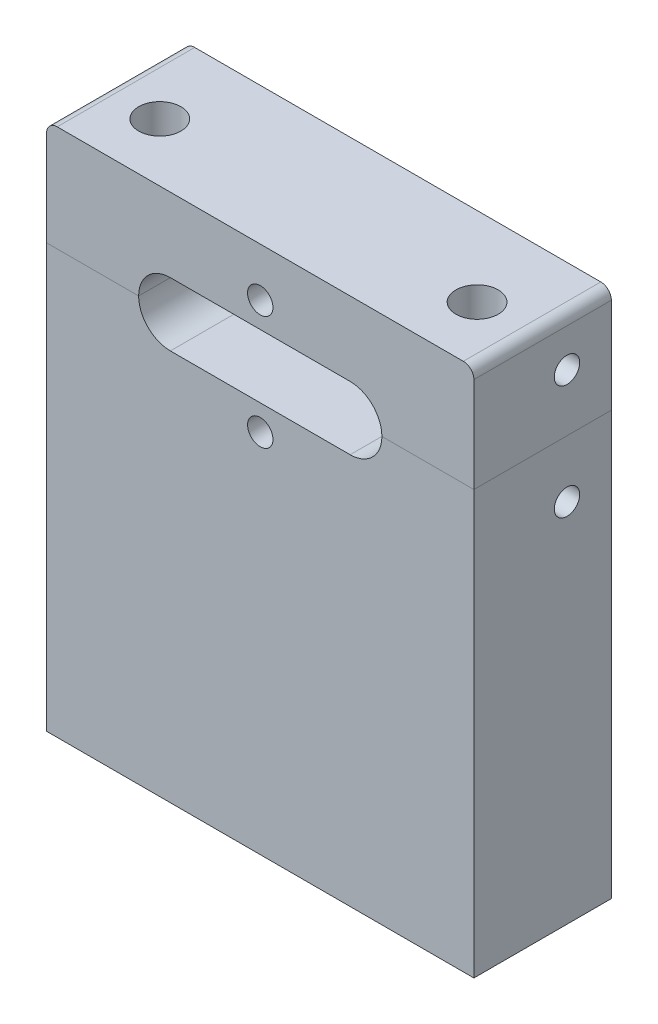
ISO-10303-21;
HEADER;
FILE_DESCRIPTION(('STEP AP214'),'2;1');
FILE_NAME('part.step','',(''),(''),'','','');
FILE_SCHEMA(('AUTOMOTIVE_DESIGN { 1 0 10303 214 1 1 1 1 }'));
ENDSEC;
DATA;
#1=APPLICATION_CONTEXT('core data for automotive mechanical design processes');
#2=APPLICATION_PROTOCOL_DEFINITION('international standard','automotive_design',2000,#1);
#3=PRODUCT_CONTEXT('',#1,'mechanical');
#4=PRODUCT('Part','Part','',(#3));
#5=PRODUCT_RELATED_PRODUCT_CATEGORY('part','',(#4));
#6=PRODUCT_DEFINITION_FORMATION('','',#4);
#7=PRODUCT_DEFINITION_CONTEXT('part definition',#1,'design');
#8=PRODUCT_DEFINITION('design','',#6,#7);
#9=PRODUCT_DEFINITION_SHAPE('','',#8);
#10=(LENGTH_UNIT() NAMED_UNIT(*) SI_UNIT(.MILLI.,.METRE.));
#11=(NAMED_UNIT(*) PLANE_ANGLE_UNIT() SI_UNIT($,.RADIAN.));
#12=(NAMED_UNIT(*) SI_UNIT($,.STERADIAN.) SOLID_ANGLE_UNIT());
#13=UNCERTAINTY_MEASURE_WITH_UNIT(LENGTH_MEASURE(1.E-05),#10,'distance_accuracy_value','');
#14=(GEOMETRIC_REPRESENTATION_CONTEXT(3) GLOBAL_UNCERTAINTY_ASSIGNED_CONTEXT((#13)) GLOBAL_UNIT_ASSIGNED_CONTEXT((#10,
#11,#12)) REPRESENTATION_CONTEXT('',''));
#15=CARTESIAN_POINT('',(0.,0.,0.));
#16=DIRECTION('',(0.,0.,1.));
#17=DIRECTION('',(1.,0.,0.));
#18=AXIS2_PLACEMENT_3D('',#15,#16,#17);
#19=CARTESIAN_POINT('',(0.,25.4,0.));
#20=DIRECTION('',(0.,1.,0.));
#21=DIRECTION('',(0.,0.,1.));
#22=AXIS2_PLACEMENT_3D('',#19,#20,#21);
#23=PLANE('',#22);
#24=DIRECTION('',(0.,0.,-1.));
#25=VECTOR('',#24,1.);
#26=CARTESIAN_POINT('',(-7.3025,25.4,21.2725));
#27=LINE('',#26,#25);
#28=CARTESIAN_POINT('',(-7.3025,25.4,4.1275));
#29=VERTEX_POINT('',#28);
#30=CARTESIAN_POINT('',(-7.3025,25.4,-4.1275));
#31=VERTEX_POINT('',#30);
#32=EDGE_CURVE('E129',#29,#31,#27,.T.);
#33=ORIENTED_EDGE('',*,*,#32,.T.);
#34=DIRECTION('',(-1.,0.,0.));
#35=VECTOR('',#34,1.);
#36=CARTESIAN_POINT('',(-12.827,25.4,-4.1275));
#37=LINE('',#36,#35);
#38=CARTESIAN_POINT('',(-12.827,25.4,-4.1275));
#39=VERTEX_POINT('',#38);
#40=EDGE_CURVE('E124',#31,#39,#37,.T.);
#41=ORIENTED_EDGE('',*,*,#40,.T.);
#42=DIRECTION('',(0.,0.,1.));
#43=VECTOR('',#42,1.);
#44=CARTESIAN_POINT('',(-12.827,25.4,4.1275));
#45=LINE('',#44,#43);
#46=CARTESIAN_POINT('',(-12.827,25.4,4.1275));
#47=VERTEX_POINT('',#46);
#48=EDGE_CURVE('E188',#39,#47,#45,.T.);
#49=ORIENTED_EDGE('',*,*,#48,.T.);
#50=DIRECTION('',(1.,0.,0.));
#51=VECTOR('',#50,1.);
#52=CARTESIAN_POINT('',(-12.827,25.4,4.1275));
#53=LINE('',#52,#51);
#54=EDGE_CURVE('E190',#47,#29,#53,.T.);
#55=ORIENTED_EDGE('',*,*,#54,.T.);
#56=EDGE_LOOP('',(#33,#41,#49,#55));
#57=FACE_BOUND('',#56,.T.);
#58=CARTESIAN_POINT('',(-9.525,25.4,0.635));
#59=DIRECTION('',(0.,1.,0.));
#60=DIRECTION('',(0.,0.,1.));
#61=AXIS2_PLACEMENT_3D('',#58,#59,#60);
#62=CIRCLE('',#61,1.27);
#63=CARTESIAN_POINT('',(-9.525,25.4,1.905));
#64=VERTEX_POINT('',#63);
#65=EDGE_CURVE('E136',#64,#64,#62,.F.);
#66=ORIENTED_EDGE('',*,*,#65,.T.);
#67=EDGE_LOOP('',(#66));
#68=FACE_BOUND('',#67,.T.);
#69=ADVANCED_FACE('F42',(#57,#68),#23,.T.);
#70=CARTESIAN_POINT('',(7.3025,25.4,4.1275));
#71=VERTEX_POINT('',#70);
#72=CARTESIAN_POINT('',(12.827,25.4,4.1275));
#73=VERTEX_POINT('',#72);
#74=EDGE_CURVE('E133',#71,#73,#53,.T.);
#75=ORIENTED_EDGE('',*,*,#74,.T.);
#76=DIRECTION('',(0.,0.,-1.));
#77=VECTOR('',#76,1.);
#78=CARTESIAN_POINT('',(12.827,25.4,4.1275));
#79=LINE('',#78,#77);
#80=CARTESIAN_POINT('',(12.827,25.4,-4.1275));
#81=VERTEX_POINT('',#80);
#82=EDGE_CURVE('E123',#73,#81,#79,.T.);
#83=ORIENTED_EDGE('',*,*,#82,.T.);
#84=CARTESIAN_POINT('',(7.3025,25.4,-4.1275));
#85=VERTEX_POINT('',#84);
#86=EDGE_CURVE('E112',#81,#85,#37,.T.);
#87=ORIENTED_EDGE('',*,*,#86,.T.);
#88=DIRECTION('',(0.,0.,-1.));
#89=VECTOR('',#88,1.);
#90=CARTESIAN_POINT('',(7.3025,25.4,21.2725));
#91=LINE('',#90,#89);
#92=EDGE_CURVE('E121',#85,#71,#91,.F.);
#93=ORIENTED_EDGE('',*,*,#92,.T.);
#94=EDGE_LOOP('',(#75,#83,#87,#93));
#95=FACE_BOUND('',#94,.T.);
#96=CARTESIAN_POINT('',(9.525,25.4,0.635));
#97=DIRECTION('',(0.,1.,0.));
#98=DIRECTION('',(0.,0.,1.));
#99=AXIS2_PLACEMENT_3D('',#96,#97,#98);
#100=CIRCLE('',#99,1.27);
#101=CARTESIAN_POINT('',(9.525,25.4,1.905));
#102=VERTEX_POINT('',#101);
#103=EDGE_CURVE('E130',#102,#102,#100,.F.);
#104=ORIENTED_EDGE('',*,*,#103,.T.);
#105=EDGE_LOOP('',(#104));
#106=FACE_BOUND('',#105,.T.);
#107=ADVANCED_FACE('F119',(#95,#106),#23,.T.);
#108=CARTESIAN_POINT('',(9.525,19.05,0.635));
#109=DIRECTION('',(0.,1.,0.));
#110=DIRECTION('',(0.,0.,1.));
#111=AXIS2_PLACEMENT_3D('',#108,#109,#110);
#112=PLANE('',#111);
#113=CARTESIAN_POINT('',(9.525,19.05,0.635));
#114=DIRECTION('',(0.,1.,0.));
#115=DIRECTION('',(0.,0.,1.));
#116=AXIS2_PLACEMENT_3D('',#113,#114,#115);
#117=CIRCLE('',#116,1.27);
#118=CARTESIAN_POINT('',(9.525,19.05,1.905));
#119=VERTEX_POINT('',#118);
#120=EDGE_CURVE('E51',#119,#119,#117,.T.);
#121=ORIENTED_EDGE('',*,*,#120,.T.);
#122=EDGE_LOOP('',(#121));
#123=FACE_BOUND('',#122,.T.);
#124=ADVANCED_FACE('F224',(#123),#112,.T.);
#125=CARTESIAN_POINT('',(9.525,19.05,0.635));
#126=DIRECTION('',(0.,1.,0.));
#127=DIRECTION('',(0.,0.,1.));
#128=AXIS2_PLACEMENT_3D('',#125,#126,#127);
#129=CYLINDRICAL_SURFACE('',#128,1.27);
#130=ORIENTED_EDGE('',*,*,#120,.F.);
#131=EDGE_LOOP('',(#130));
#132=FACE_BOUND('',#131,.T.);
#133=ORIENTED_EDGE('',*,*,#103,.F.);
#134=EDGE_LOOP('',(#133));
#135=FACE_BOUND('',#134,.T.);
#136=ADVANCED_FACE('F232',(#132,#135),#129,.F.);
#137=CARTESIAN_POINT('',(12.827,31.75,4.1275));
#138=DIRECTION('',(-1.,0.,0.));
#139=DIRECTION('',(0.,0.,1.));
#140=AXIS2_PLACEMENT_3D('',#137,#138,#139);
#141=PLANE('',#140);
#142=CARTESIAN_POINT('',(12.827,21.971,-1.4605));
#143=DIRECTION('',(1.,0.,0.));
#144=DIRECTION('',(0.,0.,-1.));
#145=AXIS2_PLACEMENT_3D('',#142,#143,#144);
#146=CIRCLE('',#145,0.762);
#147=CARTESIAN_POINT('',(12.827,21.971,-2.2225));
#148=VERTEX_POINT('',#147);
#149=EDGE_CURVE('E179',#148,#148,#146,.T.);
#150=ORIENTED_EDGE('',*,*,#149,.F.);
#151=EDGE_LOOP('',(#150));
#152=FACE_BOUND('',#151,.T.);
#153=ORIENTED_EDGE('',*,*,#82,.F.);
#154=DIRECTION('',(0.,-1.,0.));
#155=VECTOR('',#154,1.);
#156=CARTESIAN_POINT('',(12.827,31.75,4.1275));
#157=LINE('',#156,#155);
#158=CARTESIAN_POINT('',(12.827,0.,4.1275));
#159=VERTEX_POINT('',#158);
#160=EDGE_CURVE('E152',#73,#159,#157,.T.);
#161=ORIENTED_EDGE('',*,*,#160,.T.);
#162=DIRECTION('',(0.,0.,-1.));
#163=VECTOR('',#162,1.);
#164=CARTESIAN_POINT('',(12.827,0.,4.1275));
#165=LINE('',#164,#163);
#166=CARTESIAN_POINT('',(12.827,0.,-4.1275));
#167=VERTEX_POINT('',#166);
#168=EDGE_CURVE('E169',#159,#167,#165,.T.);
#169=ORIENTED_EDGE('',*,*,#168,.T.);
#170=DIRECTION('',(0.,-1.,0.));
#171=VECTOR('',#170,1.);
#172=CARTESIAN_POINT('',(12.827,31.75,-4.1275));
#173=LINE('',#172,#171);
#174=EDGE_CURVE('E146',#81,#167,#173,.T.);
#175=ORIENTED_EDGE('',*,*,#174,.F.);
#176=EDGE_LOOP('',(#153,#161,#169,#175));
#177=FACE_BOUND('',#176,.T.);
#178=ADVANCED_FACE('F235',(#152,#177),#141,.F.);
#179=CARTESIAN_POINT('',(-12.827,31.75,-4.1275));
#180=DIRECTION('',(0.,0.,1.));
#181=DIRECTION('',(1.,0.,0.));
#182=AXIS2_PLACEMENT_3D('',#179,#180,#181);
#183=PLANE('',#182);
#184=ORIENTED_EDGE('',*,*,#86,.F.);
#185=ORIENTED_EDGE('',*,*,#174,.T.);
#186=DIRECTION('',(-1.,0.,0.));
#187=VECTOR('',#186,1.);
#188=CARTESIAN_POINT('',(-12.827,0.,-4.1275));
#189=LINE('',#188,#187);
#190=CARTESIAN_POINT('',(-12.827,0.,-4.1275));
#191=VERTEX_POINT('',#190);
#192=EDGE_CURVE('E163',#167,#191,#189,.T.);
#193=ORIENTED_EDGE('',*,*,#192,.T.);
#194=DIRECTION('',(0.,-1.,0.));
#195=VECTOR('',#194,1.);
#196=CARTESIAN_POINT('',(-12.827,31.75,-4.1275));
#197=LINE('',#196,#195);
#198=EDGE_CURVE('E148',#39,#191,#197,.T.);
#199=ORIENTED_EDGE('',*,*,#198,.F.);
#200=ORIENTED_EDGE('',*,*,#40,.F.);
#201=CARTESIAN_POINT('',(-5.3975,25.4,-4.1275));
#202=DIRECTION('',(0.,0.,-1.));
#203=DIRECTION('',(-1.,0.,0.));
#204=AXIS2_PLACEMENT_3D('',#201,#202,#203);
#205=CIRCLE('',#204,1.905);
#206=CARTESIAN_POINT('',(-5.3975,23.495,-4.1275));
#207=VERTEX_POINT('',#206);
#208=EDGE_CURVE('E46',#207,#31,#205,.T.);
#209=ORIENTED_EDGE('',*,*,#208,.F.);
#210=DIRECTION('',(-1.,0.,0.));
#211=VECTOR('',#210,1.);
#212=CARTESIAN_POINT('',(-5.3975,23.495,-4.1275));
#213=LINE('',#212,#211);
#214=CARTESIAN_POINT('',(5.3975,23.495,-4.1275));
#215=VERTEX_POINT('',#214);
#216=EDGE_CURVE('E114',#215,#207,#213,.T.);
#217=ORIENTED_EDGE('',*,*,#216,.F.);
#218=CARTESIAN_POINT('',(5.3975,25.4,-4.1275));
#219=DIRECTION('',(0.,0.,-1.));
#220=DIRECTION('',(-1.,0.,0.));
#221=AXIS2_PLACEMENT_3D('',#218,#219,#220);
#222=CIRCLE('',#221,1.905);
#223=EDGE_CURVE('E59',#85,#215,#222,.T.);
#224=ORIENTED_EDGE('',*,*,#223,.F.);
#225=EDGE_LOOP('',(#184,#185,#193,#199,#200,#209,#217,#224));
#226=FACE_BOUND('',#225,.T.);
#227=ADVANCED_FACE('F111',(#226),#183,.F.);
#228=CARTESIAN_POINT('',(-12.827,31.75,4.1275));
#229=DIRECTION('',(1.,0.,0.));
#230=DIRECTION('',(0.,0.,-1.));
#231=AXIS2_PLACEMENT_3D('',#228,#229,#230);
#232=PLANE('',#231);
#233=ORIENTED_EDGE('',*,*,#48,.F.);
#234=ORIENTED_EDGE('',*,*,#198,.T.);
#235=DIRECTION('',(0.,0.,1.));
#236=VECTOR('',#235,1.);
#237=CARTESIAN_POINT('',(-12.827,0.,4.1275));
#238=LINE('',#237,#236);
#239=CARTESIAN_POINT('',(-12.827,0.,4.1275));
#240=VERTEX_POINT('',#239);
#241=EDGE_CURVE('E157',#191,#240,#238,.T.);
#242=ORIENTED_EDGE('',*,*,#241,.T.);
#243=DIRECTION('',(0.,-1.,0.));
#244=VECTOR('',#243,1.);
#245=CARTESIAN_POINT('',(-12.827,31.75,4.1275));
#246=LINE('',#245,#244);
#247=EDGE_CURVE('E150',#47,#240,#246,.T.);
#248=ORIENTED_EDGE('',*,*,#247,.F.);
#249=EDGE_LOOP('',(#233,#234,#242,#248));
#250=FACE_BOUND('',#249,.T.);
#251=ADVANCED_FACE('F199',(#250),#232,.F.);
#252=CARTESIAN_POINT('',(-12.827,31.75,4.1275));
#253=DIRECTION('',(0.,0.,-1.));
#254=DIRECTION('',(-1.,0.,0.));
#255=AXIS2_PLACEMENT_3D('',#252,#253,#254);
#256=PLANE('',#255);
#257=CARTESIAN_POINT('',(0.,21.971,4.1275));
#258=DIRECTION('',(0.,0.,1.));
#259=DIRECTION('',(1.,0.,0.));
#260=AXIS2_PLACEMENT_3D('',#257,#258,#259);
#261=CIRCLE('',#260,0.762);
#262=CARTESIAN_POINT('',(-0.761999999999999,21.971,4.1275));
#263=VERTEX_POINT('',#262);
#264=EDGE_CURVE('E175',#263,#263,#261,.T.);
#265=ORIENTED_EDGE('',*,*,#264,.F.);
#266=EDGE_LOOP('',(#265));
#267=FACE_BOUND('',#266,.T.);
#268=ORIENTED_EDGE('',*,*,#54,.F.);
#269=ORIENTED_EDGE('',*,*,#247,.T.);
#270=DIRECTION('',(1.,0.,0.));
#271=VECTOR('',#270,1.);
#272=CARTESIAN_POINT('',(-12.827,0.,4.1275));
#273=LINE('',#272,#271);
#274=EDGE_CURVE('E153',#240,#159,#273,.T.);
#275=ORIENTED_EDGE('',*,*,#274,.T.);
#276=ORIENTED_EDGE('',*,*,#160,.F.);
#277=ORIENTED_EDGE('',*,*,#74,.F.);
#278=CARTESIAN_POINT('',(5.3975,25.4,4.1275));
#279=DIRECTION('',(0.,0.,-1.));
#280=DIRECTION('',(-1.,0.,0.));
#281=AXIS2_PLACEMENT_3D('',#278,#279,#280);
#282=CIRCLE('',#281,1.905);
#283=CARTESIAN_POINT('',(5.3975,23.495,4.1275));
#284=VERTEX_POINT('',#283);
#285=EDGE_CURVE('E127',#71,#284,#282,.T.);
#286=ORIENTED_EDGE('',*,*,#285,.T.);
#287=DIRECTION('',(-1.,0.,0.));
#288=VECTOR('',#287,1.);
#289=CARTESIAN_POINT('',(-12.827,23.495,4.1275));
#290=LINE('',#289,#288);
#291=CARTESIAN_POINT('',(-5.3975,23.495,4.1275));
#292=VERTEX_POINT('',#291);
#293=EDGE_CURVE('E144',#284,#292,#290,.T.);
#294=ORIENTED_EDGE('',*,*,#293,.T.);
#295=CARTESIAN_POINT('',(-5.3975,25.4,4.1275));
#296=DIRECTION('',(0.,0.,-1.));
#297=DIRECTION('',(-1.,0.,0.));
#298=AXIS2_PLACEMENT_3D('',#295,#296,#297);
#299=CIRCLE('',#298,1.905);
#300=EDGE_CURVE('E142',#292,#29,#299,.T.);
#301=ORIENTED_EDGE('',*,*,#300,.T.);
#302=EDGE_LOOP('',(#268,#269,#275,#276,#277,#286,#294,#301));
#303=FACE_BOUND('',#302,.T.);
#304=ADVANCED_FACE('F201',(#267,#303),#256,.F.);
#305=CARTESIAN_POINT('',(-5.3975,25.4,21.2725));
#306=DIRECTION('',(0.,0.,-1.));
#307=DIRECTION('',(-1.,0.,0.));
#308=AXIS2_PLACEMENT_3D('',#305,#306,#307);
#309=CYLINDRICAL_SURFACE('',#308,1.905);
#310=ORIENTED_EDGE('',*,*,#32,.F.);
#311=ORIENTED_EDGE('',*,*,#300,.F.);
#312=DIRECTION('',(0.,0.,-1.));
#313=VECTOR('',#312,1.);
#314=CARTESIAN_POINT('',(-5.3975,23.495,21.2725));
#315=LINE('',#314,#313);
#316=EDGE_CURVE('E67',#292,#207,#315,.T.);
#317=ORIENTED_EDGE('',*,*,#316,.T.);
#318=ORIENTED_EDGE('',*,*,#208,.T.);
#319=EDGE_LOOP('',(#310,#311,#317,#318));
#320=FACE_BOUND('',#319,.T.);
#321=ADVANCED_FACE('F44',(#320),#309,.F.);
#322=CARTESIAN_POINT('',(5.3975,25.4,21.2725));
#323=DIRECTION('',(0.,0.,-1.));
#324=DIRECTION('',(-1.,0.,0.));
#325=AXIS2_PLACEMENT_3D('',#322,#323,#324);
#326=CYLINDRICAL_SURFACE('',#325,1.905);
#327=ORIENTED_EDGE('',*,*,#92,.F.);
#328=ORIENTED_EDGE('',*,*,#223,.T.);
#329=DIRECTION('',(0.,0.,-1.));
#330=VECTOR('',#329,1.);
#331=CARTESIAN_POINT('',(5.3975,23.495,21.2725));
#332=LINE('',#331,#330);
#333=EDGE_CURVE('E171',#284,#215,#332,.T.);
#334=ORIENTED_EDGE('',*,*,#333,.F.);
#335=ORIENTED_EDGE('',*,*,#285,.F.);
#336=EDGE_LOOP('',(#327,#328,#334,#335));
#337=FACE_BOUND('',#336,.T.);
#338=ADVANCED_FACE('F126',(#337),#326,.F.);
#339=CARTESIAN_POINT('',(0.,0.,0.));
#340=DIRECTION('',(0.,-1.,0.));
#341=DIRECTION('',(0.,0.,-1.));
#342=AXIS2_PLACEMENT_3D('',#339,#340,#341);
#343=PLANE('',#342);
#344=ORIENTED_EDGE('',*,*,#168,.F.);
#345=ORIENTED_EDGE('',*,*,#274,.F.);
#346=ORIENTED_EDGE('',*,*,#241,.F.);
#347=ORIENTED_EDGE('',*,*,#192,.F.);
#348=EDGE_LOOP('',(#344,#345,#346,#347));
#349=FACE_BOUND('',#348,.T.);
#350=ADVANCED_FACE('F245',(#349),#343,.T.);
#351=CARTESIAN_POINT('',(-5.3975,23.495,21.2725));
#352=DIRECTION('',(0.,-1.,0.));
#353=DIRECTION('',(1.,0.,0.));
#354=AXIS2_PLACEMENT_3D('',#351,#352,#353);
#355=PLANE('',#354);
#356=ORIENTED_EDGE('',*,*,#333,.T.);
#357=ORIENTED_EDGE('',*,*,#216,.T.);
#358=ORIENTED_EDGE('',*,*,#316,.F.);
#359=ORIENTED_EDGE('',*,*,#293,.F.);
#360=EDGE_LOOP('',(#356,#357,#358,#359));
#361=FACE_BOUND('',#360,.T.);
#362=ADVANCED_FACE('F247',(#361),#355,.F.);
#363=CARTESIAN_POINT('',(5.588,21.971,4.1275));
#364=DIRECTION('',(0.,1.,0.));
#365=DIRECTION('',(0.,0.,1.));
#366=AXIS2_PLACEMENT_3D('',#363,#364,#365);
#367=TOROIDAL_SURFACE('',#366,5.588,0.762);
#368=CARTESIAN_POINT('',(5.58800000000002,21.971,-1.4605));
#369=DIRECTION('',(-1.,0.,0.));
#370=DIRECTION('',(0.,0.,1.));
#371=AXIS2_PLACEMENT_3D('',#368,#369,#370);
#372=CIRCLE('',#371,0.762);
#373=CARTESIAN_POINT('',(5.58800000000002,21.971,-2.2225));
#374=VERTEX_POINT('',#373);
#375=EDGE_CURVE('E178',#374,#374,#372,.F.);
#376=CARTESIAN_POINT('',(5.588,21.971,4.1275));
#377=DIRECTION('',(0.,1.,0.));
#378=DIRECTION('',(0.,0.,1.));
#379=AXIS2_PLACEMENT_3D('',#376,#377,#378);
#380=CIRCLE('',#379,6.35);
#381=EDGE_CURVE('',#374,#263,#380,.T.);
#382=ORIENTED_EDGE('',*,*,#375,.T.);
#383=ORIENTED_EDGE('',*,*,#264,.T.);
#384=ORIENTED_EDGE('',*,*,#381,.T.);
#385=ORIENTED_EDGE('',*,*,#381,.F.);
#386=EDGE_LOOP('',(#382,#384,#383,#385));
#387=FACE_BOUND('',#386,.T.);
#388=ADVANCED_FACE('F225',(#387),#367,.F.);
#389=CARTESIAN_POINT('',(-12.828,21.971,-1.4605));
#390=DIRECTION('',(1.,0.,0.));
#391=DIRECTION('',(0.,0.,-1.));
#392=AXIS2_PLACEMENT_3D('',#389,#390,#391);
#393=CYLINDRICAL_SURFACE('',#392,0.762);
#394=CARTESIAN_POINT('',(5.58800000000002,21.971,-2.2225));
#395=CARTESIAN_POINT('',(5.66340625000003,21.971,-2.2225));
#396=CARTESIAN_POINT('',(5.73881250000002,21.971,-2.2225));
#397=CARTESIAN_POINT('',(5.88962500000003,21.971,-2.2225));
#398=CARTESIAN_POINT('',(5.96503125000002,21.971,-2.2225));
#399=CARTESIAN_POINT('',(6.11584375000002,21.971,-2.2225));
#400=CARTESIAN_POINT('',(6.19125000000002,21.971,-2.2225));
#401=CARTESIAN_POINT('',(6.34206250000002,21.971,-2.2225));
#402=CARTESIAN_POINT('',(6.41746875000002,21.971,-2.2225));
#403=CARTESIAN_POINT('',(6.56828125000002,21.971,-2.2225));
#404=CARTESIAN_POINT('',(6.64368750000002,21.971,-2.2225));
#405=CARTESIAN_POINT('',(6.79450000000002,21.971,-2.2225));
#406=CARTESIAN_POINT('',(6.86990625000002,21.971,-2.2225));
#407=CARTESIAN_POINT('',(7.02071875000002,21.971,-2.2225));
#408=CARTESIAN_POINT('',(7.09612500000002,21.971,-2.2225));
#409=CARTESIAN_POINT('',(7.24693750000002,21.971,-2.2225));
#410=CARTESIAN_POINT('',(7.32234375000002,21.971,-2.2225));
#411=CARTESIAN_POINT('',(7.47315625000002,21.971,-2.2225));
#412=CARTESIAN_POINT('',(7.54856250000002,21.971,-2.2225));
#413=CARTESIAN_POINT('',(7.69937500000002,21.971,-2.2225));
#414=CARTESIAN_POINT('',(7.77478125000002,21.971,-2.2225));
#415=CARTESIAN_POINT('',(7.92559375000002,21.971,-2.2225));
#416=CARTESIAN_POINT('',(8.00100000000002,21.971,-2.2225));
#417=CARTESIAN_POINT('',(8.15181250000001,21.971,-2.2225));
#418=CARTESIAN_POINT('',(8.22721875000001,21.971,-2.2225));
#419=CARTESIAN_POINT('',(8.37803125000001,21.971,-2.2225));
#420=CARTESIAN_POINT('',(8.45343750000001,21.971,-2.2225));
#421=CARTESIAN_POINT('',(8.60425000000001,21.971,-2.2225));
#422=CARTESIAN_POINT('',(8.67965625000001,21.971,-2.2225));
#423=CARTESIAN_POINT('',(8.83046875000001,21.971,-2.2225));
#424=CARTESIAN_POINT('',(8.90587500000001,21.971,-2.2225));
#425=CARTESIAN_POINT('',(9.05668750000001,21.971,-2.2225));
#426=CARTESIAN_POINT('',(9.13209375000001,21.971,-2.2225));
#427=CARTESIAN_POINT('',(9.28290625000001,21.971,-2.2225));
#428=CARTESIAN_POINT('',(9.35831250000001,21.971,-2.2225));
#429=CARTESIAN_POINT('',(9.50912500000001,21.971,-2.2225));
#430=CARTESIAN_POINT('',(9.58453125000001,21.971,-2.2225));
#431=CARTESIAN_POINT('',(9.73534375000001,21.971,-2.2225));
#432=CARTESIAN_POINT('',(9.81075000000001,21.971,-2.2225));
#433=CARTESIAN_POINT('',(9.9615625,21.971,-2.2225));
#434=CARTESIAN_POINT('',(10.03696875,21.971,-2.2225));
#435=CARTESIAN_POINT('',(10.18778125,21.971,-2.2225));
#436=CARTESIAN_POINT('',(10.2631875,21.971,-2.2225));
#437=CARTESIAN_POINT('',(10.414,21.971,-2.2225));
#438=CARTESIAN_POINT('',(10.48940625,21.971,-2.2225));
#439=CARTESIAN_POINT('',(10.64021875,21.971,-2.2225));
#440=CARTESIAN_POINT('',(10.715625,21.971,-2.2225));
#441=CARTESIAN_POINT('',(10.8664375,21.971,-2.2225));
#442=CARTESIAN_POINT('',(10.94184375,21.971,-2.2225));
#443=CARTESIAN_POINT('',(11.09265625,21.971,-2.2225));
#444=CARTESIAN_POINT('',(11.1680625,21.971,-2.2225));
#445=CARTESIAN_POINT('',(11.318875,21.971,-2.2225));
#446=CARTESIAN_POINT('',(11.39428125,21.971,-2.2225));
#447=CARTESIAN_POINT('',(11.54509375,21.971,-2.2225));
#448=CARTESIAN_POINT('',(11.6205,21.971,-2.2225));
#449=CARTESIAN_POINT('',(11.7713125,21.971,-2.2225));
#450=CARTESIAN_POINT('',(11.84671875,21.971,-2.2225));
#451=CARTESIAN_POINT('',(11.99753125,21.971,-2.2225));
#452=CARTESIAN_POINT('',(12.0729375,21.971,-2.2225));
#453=CARTESIAN_POINT('',(12.22375,21.971,-2.2225));
#454=CARTESIAN_POINT('',(12.29915625,21.971,-2.2225));
#455=CARTESIAN_POINT('',(12.44996875,21.971,-2.2225));
#456=CARTESIAN_POINT('',(12.525375,21.971,-2.2225));
#457=CARTESIAN_POINT('',(12.6761875,21.971,-2.2225));
#458=CARTESIAN_POINT('',(12.75159375,21.971,-2.2225));
#459=CARTESIAN_POINT('',(12.827,21.971,-2.2225));
#460=B_SPLINE_CURVE_WITH_KNOTS('',3,(#394,#395,#396,#397,#398,#399,#400,#401,#402,#403,#404,
#405,#406,#407,#408,#409,#410,#411,#412,#413,#414,#415,#416,#417,#418,#419,#420,#421,#422,#423,
#424,#425,#426,#427,#428,#429,#430,#431,#432,#433,#434,#435,#436,#437,#438,#439,#440,#441,#442,
#443,#444,#445,#446,#447,#448,#449,#450,#451,#452,#453,#454,#455,#456,#457,#458,#459),
.UNSPECIFIED.,.F.,.F.,(4,2,2,2,2,2,2,2,2,2,2,2,2,2,2,2,2,2,2,2,2,2,2,2,2,2,2,2,2,2,2,2,4),(0.,
0.22621875,0.4524375,0.678656249999996,0.904874999999996,1.13109375,1.35731249999999,
1.58353124999999,1.80974999999999,2.03596874999999,2.26218749999999,2.48840624999999,
2.71462499999999,2.94084374999999,3.16706249999998,3.39328124999998,3.61949999999998,
3.84571874999998,4.07193749999998,4.29815624999998,4.52437499999998,4.75059374999998,
4.97681249999998,5.20303124999998,5.42924999999998,5.65546874999998,5.88168749999998,
6.10790624999997,6.33412499999997,6.56034374999997,6.78656249999997,7.01278124999997,
7.23899999999997),.UNSPECIFIED.);
#461=EDGE_CURVE('BSEAM215',#374,#148,#460,.T.);
#462=ORIENTED_EDGE('',*,*,#375,.F.);
#463=ORIENTED_EDGE('',*,*,#149,.T.);
#464=ORIENTED_EDGE('',*,*,#461,.T.);
#465=ORIENTED_EDGE('',*,*,#461,.F.);
#466=EDGE_LOOP('',(#462,#464,#463,#465));
#467=FACE_BOUND('',#466,.T.);
#468=ADVANCED_FACE('F215',(#467),#393,.F.);
#469=CARTESIAN_POINT('',(-9.525,19.05,0.635));
#470=DIRECTION('',(0.,1.,0.));
#471=DIRECTION('',(0.,0.,1.));
#472=AXIS2_PLACEMENT_3D('',#469,#470,#471);
#473=PLANE('',#472);
#474=CARTESIAN_POINT('',(-9.525,19.05,0.635));
#475=DIRECTION('',(0.,1.,0.));
#476=DIRECTION('',(0.,0.,1.));
#477=AXIS2_PLACEMENT_3D('',#474,#475,#476);
#478=CIRCLE('',#477,1.27);
#479=CARTESIAN_POINT('',(-9.525,19.05,1.905));
#480=VERTEX_POINT('',#479);
#481=EDGE_CURVE('E12',#480,#480,#478,.T.);
#482=ORIENTED_EDGE('',*,*,#481,.T.);
#483=EDGE_LOOP('',(#482));
#484=FACE_BOUND('',#483,.T.);
#485=ADVANCED_FACE('F212',(#484),#473,.T.);
#486=CARTESIAN_POINT('',(-9.525,19.05,0.635));
#487=DIRECTION('',(0.,1.,0.));
#488=DIRECTION('',(0.,0.,1.));
#489=AXIS2_PLACEMENT_3D('',#486,#487,#488);
#490=CYLINDRICAL_SURFACE('',#489,1.27);
#491=ORIENTED_EDGE('',*,*,#481,.F.);
#492=EDGE_LOOP('',(#491));
#493=FACE_BOUND('',#492,.T.);
#494=ORIENTED_EDGE('',*,*,#65,.F.);
#495=EDGE_LOOP('',(#494));
#496=FACE_BOUND('',#495,.T.);
#497=ADVANCED_FACE('F214',(#493,#496),#490,.F.);
#498=CLOSED_SHELL('',(#69,#107,#124,#136,#178,#227,#251,#304,#321,#338,#350,#362,#388,#468,#485,#497));
#499=MANIFOLD_SOLID_BREP('B2',#498);
#500=CARTESIAN_POINT('',(0.,25.4,0.));
#501=DIRECTION('',(0.,1.,0.));
#502=DIRECTION('',(0.,0.,1.));
#503=AXIS2_PLACEMENT_3D('',#500,#501,#502);
#504=PLANE('',#503);
#505=CARTESIAN_POINT('',(9.525,25.4,0.635));
#506=DIRECTION('',(0.,1.,0.));
#507=DIRECTION('',(0.,0.,1.));
#508=AXIS2_PLACEMENT_3D('',#505,#506,#507);
#509=CIRCLE('',#508,1.27);
#510=CARTESIAN_POINT('',(9.525,25.4,1.905));
#511=VERTEX_POINT('',#510);
#512=EDGE_CURVE('E509',#511,#511,#509,.F.);
#513=ORIENTED_EDGE('',*,*,#512,.F.);
#514=EDGE_LOOP('',(#513));
#515=FACE_BOUND('',#514,.T.);
#516=DIRECTION('',(1.,0.,0.));
#517=VECTOR('',#516,1.);
#518=CARTESIAN_POINT('',(-12.827,25.4,4.1275));
#519=LINE('',#518,#517);
#520=CARTESIAN_POINT('',(7.3025,25.4,4.1275));
#521=VERTEX_POINT('',#520);
#522=CARTESIAN_POINT('',(12.827,25.4,4.1275));
#523=VERTEX_POINT('',#522);
#524=EDGE_CURVE('E517',#521,#523,#519,.T.);
#525=ORIENTED_EDGE('',*,*,#524,.F.);
#526=DIRECTION('',(0.,0.,-1.));
#527=VECTOR('',#526,1.);
#528=CARTESIAN_POINT('',(7.3025,25.4,21.2725));
#529=LINE('',#528,#527);
#530=CARTESIAN_POINT('',(7.3025,25.4,-4.1275));
#531=VERTEX_POINT('',#530);
#532=EDGE_CURVE('E512',#531,#521,#529,.F.);
#533=ORIENTED_EDGE('',*,*,#532,.F.);
#534=DIRECTION('',(-1.,0.,0.));
#535=VECTOR('',#534,1.);
#536=CARTESIAN_POINT('',(-12.827,25.4,-4.1275));
#537=LINE('',#536,#535);
#538=CARTESIAN_POINT('',(12.827,25.4,-4.1275));
#539=VERTEX_POINT('',#538);
#540=EDGE_CURVE('E371',#539,#531,#537,.T.);
#541=ORIENTED_EDGE('',*,*,#540,.F.);
#542=DIRECTION('',(0.,0.,-1.));
#543=VECTOR('',#542,1.);
#544=CARTESIAN_POINT('',(12.827,25.4,4.1275));
#545=LINE('',#544,#543);
#546=EDGE_CURVE('E40',#523,#539,#545,.T.);
#547=ORIENTED_EDGE('',*,*,#546,.F.);
#548=EDGE_LOOP('',(#525,#533,#541,#547));
#549=FACE_BOUND('',#548,.T.);
#550=ADVANCED_FACE('F362',(#515,#549),#504,.F.);
#551=CARTESIAN_POINT('',(-9.525,25.4,0.635));
#552=DIRECTION('',(0.,1.,0.));
#553=DIRECTION('',(0.,0.,1.));
#554=AXIS2_PLACEMENT_3D('',#551,#552,#553);
#555=CIRCLE('',#554,1.27);
#556=CARTESIAN_POINT('',(-9.525,25.4,1.905));
#557=VERTEX_POINT('',#556);
#558=EDGE_CURVE('E506',#557,#557,#555,.F.);
#559=ORIENTED_EDGE('',*,*,#558,.F.);
#560=EDGE_LOOP('',(#559));
#561=FACE_BOUND('',#560,.T.);
#562=DIRECTION('',(0.,0.,-1.));
#563=VECTOR('',#562,1.);
#564=CARTESIAN_POINT('',(-7.3025,25.4,21.2725));
#565=LINE('',#564,#563);
#566=CARTESIAN_POINT('',(-7.3025,25.4,4.1275));
#567=VERTEX_POINT('',#566);
#568=CARTESIAN_POINT('',(-7.3025,25.4,-4.1275));
#569=VERTEX_POINT('',#568);
#570=EDGE_CURVE('E514',#567,#569,#565,.T.);
#571=ORIENTED_EDGE('',*,*,#570,.F.);
#572=CARTESIAN_POINT('',(-12.827,25.4,4.1275));
#573=VERTEX_POINT('',#572);
#574=EDGE_CURVE('E515',#573,#567,#519,.T.);
#575=ORIENTED_EDGE('',*,*,#574,.F.);
#576=DIRECTION('',(0.,0.,1.));
#577=VECTOR('',#576,1.);
#578=CARTESIAN_POINT('',(-12.827,25.4,4.1275));
#579=LINE('',#578,#577);
#580=CARTESIAN_POINT('',(-12.827,25.4,-4.1275));
#581=VERTEX_POINT('',#580);
#582=EDGE_CURVE('E366',#581,#573,#579,.T.);
#583=ORIENTED_EDGE('',*,*,#582,.F.);
#584=EDGE_CURVE('E385',#569,#581,#537,.T.);
#585=ORIENTED_EDGE('',*,*,#584,.F.);
#586=EDGE_LOOP('',(#571,#575,#583,#585));
#587=FACE_BOUND('',#586,.T.);
#588=ADVANCED_FACE('F364',(#561,#587),#504,.F.);
#589=CARTESIAN_POINT('',(-12.828,28.829,-1.4605));
#590=DIRECTION('',(1.,0.,0.));
#591=DIRECTION('',(0.,0.,-1.));
#592=AXIS2_PLACEMENT_3D('',#589,#590,#591);
#593=CYLINDRICAL_SURFACE('',#592,0.762);
#594=CARTESIAN_POINT('',(5.58800000000002,28.829,-1.4605));
#595=DIRECTION('',(-1.,0.,0.));
#596=DIRECTION('',(0.,0.,1.));
#597=AXIS2_PLACEMENT_3D('',#594,#595,#596);
#598=CIRCLE('',#597,0.762);
#599=CARTESIAN_POINT('',(5.58800000000002,28.829,-2.2225));
#600=VERTEX_POINT('',#599);
#601=EDGE_CURVE('E551',#600,#600,#598,.F.);
#602=CARTESIAN_POINT('',(12.827,28.829,-1.4605));
#603=DIRECTION('',(1.,0.,0.));
#604=DIRECTION('',(0.,0.,-1.));
#605=AXIS2_PLACEMENT_3D('',#602,#603,#604);
#606=CIRCLE('',#605,0.762);
#607=CARTESIAN_POINT('',(12.827,28.829,-2.2225));
#608=VERTEX_POINT('',#607);
#609=EDGE_CURVE('E554',#608,#608,#606,.T.);
#610=CARTESIAN_POINT('',(5.58800000000002,28.829,-2.2225));
#611=CARTESIAN_POINT('',(5.66340625000003,28.829,-2.2225));
#612=CARTESIAN_POINT('',(5.73881250000002,28.829,-2.2225));
#613=CARTESIAN_POINT('',(5.88962500000003,28.829,-2.2225));
#614=CARTESIAN_POINT('',(5.96503125000002,28.829,-2.2225));
#615=CARTESIAN_POINT('',(6.11584375000002,28.829,-2.2225));
#616=CARTESIAN_POINT('',(6.19125000000002,28.829,-2.2225));
#617=CARTESIAN_POINT('',(6.34206250000002,28.829,-2.2225));
#618=CARTESIAN_POINT('',(6.41746875000002,28.829,-2.2225));
#619=CARTESIAN_POINT('',(6.56828125000002,28.829,-2.2225));
#620=CARTESIAN_POINT('',(6.64368750000002,28.829,-2.2225));
#621=CARTESIAN_POINT('',(6.79450000000002,28.829,-2.2225));
#622=CARTESIAN_POINT('',(6.86990625000002,28.829,-2.2225));
#623=CARTESIAN_POINT('',(7.02071875000002,28.829,-2.2225));
#624=CARTESIAN_POINT('',(7.09612500000002,28.829,-2.2225));
#625=CARTESIAN_POINT('',(7.24693750000002,28.829,-2.2225));
#626=CARTESIAN_POINT('',(7.32234375000002,28.829,-2.2225));
#627=CARTESIAN_POINT('',(7.47315625000002,28.829,-2.2225));
#628=CARTESIAN_POINT('',(7.54856250000002,28.829,-2.2225));
#629=CARTESIAN_POINT('',(7.69937500000002,28.829,-2.2225));
#630=CARTESIAN_POINT('',(7.77478125000002,28.829,-2.2225));
#631=CARTESIAN_POINT('',(7.92559375000002,28.829,-2.2225));
#632=CARTESIAN_POINT('',(8.00100000000002,28.829,-2.2225));
#633=CARTESIAN_POINT('',(8.15181250000001,28.829,-2.2225));
#634=CARTESIAN_POINT('',(8.22721875000001,28.829,-2.2225));
#635=CARTESIAN_POINT('',(8.37803125000001,28.829,-2.2225));
#636=CARTESIAN_POINT('',(8.45343750000001,28.829,-2.2225));
#637=CARTESIAN_POINT('',(8.60425000000001,28.829,-2.2225));
#638=CARTESIAN_POINT('',(8.67965625000001,28.829,-2.2225));
#639=CARTESIAN_POINT('',(8.83046875000001,28.829,-2.2225));
#640=CARTESIAN_POINT('',(8.90587500000001,28.829,-2.2225));
#641=CARTESIAN_POINT('',(9.05668750000001,28.829,-2.2225));
#642=CARTESIAN_POINT('',(9.13209375000001,28.829,-2.2225));
#643=CARTESIAN_POINT('',(9.28290625000001,28.829,-2.2225));
#644=CARTESIAN_POINT('',(9.35831250000001,28.829,-2.2225));
#645=CARTESIAN_POINT('',(9.50912500000001,28.829,-2.2225));
#646=CARTESIAN_POINT('',(9.58453125000001,28.829,-2.2225));
#647=CARTESIAN_POINT('',(9.73534375000001,28.829,-2.2225));
#648=CARTESIAN_POINT('',(9.81075000000001,28.829,-2.2225));
#649=CARTESIAN_POINT('',(9.9615625,28.829,-2.2225));
#650=CARTESIAN_POINT('',(10.03696875,28.829,-2.2225));
#651=CARTESIAN_POINT('',(10.18778125,28.829,-2.2225));
#652=CARTESIAN_POINT('',(10.2631875,28.829,-2.2225));
#653=CARTESIAN_POINT('',(10.414,28.829,-2.2225));
#654=CARTESIAN_POINT('',(10.48940625,28.829,-2.2225));
#655=CARTESIAN_POINT('',(10.64021875,28.829,-2.2225));
#656=CARTESIAN_POINT('',(10.715625,28.829,-2.2225));
#657=CARTESIAN_POINT('',(10.8664375,28.829,-2.2225));
#658=CARTESIAN_POINT('',(10.94184375,28.829,-2.2225));
#659=CARTESIAN_POINT('',(11.09265625,28.829,-2.2225));
#660=CARTESIAN_POINT('',(11.1680625,28.829,-2.2225));
#661=CARTESIAN_POINT('',(11.318875,28.829,-2.2225));
#662=CARTESIAN_POINT('',(11.39428125,28.829,-2.2225));
#663=CARTESIAN_POINT('',(11.54509375,28.829,-2.2225));
#664=CARTESIAN_POINT('',(11.6205,28.829,-2.2225));
#665=CARTESIAN_POINT('',(11.7713125,28.829,-2.2225));
#666=CARTESIAN_POINT('',(11.84671875,28.829,-2.2225));
#667=CARTESIAN_POINT('',(11.99753125,28.829,-2.2225));
#668=CARTESIAN_POINT('',(12.0729375,28.829,-2.2225));
#669=CARTESIAN_POINT('',(12.22375,28.829,-2.2225));
#670=CARTESIAN_POINT('',(12.29915625,28.829,-2.2225));
#671=CARTESIAN_POINT('',(12.44996875,28.829,-2.2225));
#672=CARTESIAN_POINT('',(12.525375,28.829,-2.2225));
#673=CARTESIAN_POINT('',(12.6761875,28.829,-2.2225));
#674=CARTESIAN_POINT('',(12.75159375,28.829,-2.2225));
#675=CARTESIAN_POINT('',(12.827,28.829,-2.2225));
#676=B_SPLINE_CURVE_WITH_KNOTS('',3,(#610,#611,#612,#613,#614,#615,#616,#617,#618,#619,#620,
#621,#622,#623,#624,#625,#626,#627,#628,#629,#630,#631,#632,#633,#634,#635,#636,#637,#638,#639,
#640,#641,#642,#643,#644,#645,#646,#647,#648,#649,#650,#651,#652,#653,#654,#655,#656,#657,#658,
#659,#660,#661,#662,#663,#664,#665,#666,#667,#668,#669,#670,#671,#672,#673,#674,#675),
.UNSPECIFIED.,.F.,.F.,(4,2,2,2,2,2,2,2,2,2,2,2,2,2,2,2,2,2,2,2,2,2,2,2,2,2,2,2,2,2,2,2,4),(0.,
0.22621875,0.4524375,0.678656249999996,0.904874999999996,1.13109375,1.35731249999999,
1.58353124999999,1.80974999999999,2.03596874999999,2.26218749999999,2.48840624999999,
2.71462499999999,2.94084374999999,3.16706249999998,3.39328124999998,3.61949999999998,
3.84571874999998,4.07193749999998,4.29815624999998,4.52437499999998,4.75059374999998,
4.97681249999998,5.20303124999998,5.42924999999998,5.65546874999998,5.88168749999998,
6.10790624999997,6.33412499999997,6.56034374999997,6.78656249999997,7.01278124999997,
7.23899999999997),.UNSPECIFIED.);
#677=EDGE_CURVE('BSEAM589',#600,#608,#676,.T.);
#678=ORIENTED_EDGE('',*,*,#601,.F.);
#679=ORIENTED_EDGE('',*,*,#609,.T.);
#680=ORIENTED_EDGE('',*,*,#677,.T.);
#681=ORIENTED_EDGE('',*,*,#677,.F.);
#682=EDGE_LOOP('',(#678,#680,#679,#681));
#683=FACE_BOUND('',#682,.T.);
#684=ADVANCED_FACE('F589',(#683),#593,.F.);
#685=CARTESIAN_POINT('',(-12.192,31.115,0.));
#686=DIRECTION('',(0.,0.,1.));
#687=DIRECTION('',(1.,0.,0.));
#688=AXIS2_PLACEMENT_3D('',#685,#686,#687);
#689=CYLINDRICAL_SURFACE('',#688,0.635);
#690=CARTESIAN_POINT('',(-12.192,31.115,-4.1275));
#691=DIRECTION('',(0.,0.,1.));
#692=DIRECTION('',(1.,0.,0.));
#693=AXIS2_PLACEMENT_3D('',#690,#691,#692);
#694=CIRCLE('',#693,0.635);
#695=CARTESIAN_POINT('',(-12.827,31.115,-4.1275));
#696=VERTEX_POINT('',#695);
#697=CARTESIAN_POINT('',(-12.192,31.75,-4.1275));
#698=VERTEX_POINT('',#697);
#699=EDGE_CURVE('E502',#696,#698,#694,.F.);
#700=ORIENTED_EDGE('',*,*,#699,.F.);
#701=DIRECTION('',(0.,0.,1.));
#702=VECTOR('',#701,1.);
#703=CARTESIAN_POINT('',(-12.827,31.115,4.1275));
#704=LINE('',#703,#702);
#705=CARTESIAN_POINT('',(-12.827,31.115,4.1275));
#706=VERTEX_POINT('',#705);
#707=EDGE_CURVE('E498',#706,#696,#704,.F.);
#708=ORIENTED_EDGE('',*,*,#707,.F.);
#709=CARTESIAN_POINT('',(-12.192,31.115,4.1275));
#710=DIRECTION('',(0.,0.,-1.));
#711=DIRECTION('',(-1.,0.,0.));
#712=AXIS2_PLACEMENT_3D('',#709,#710,#711);
#713=CIRCLE('',#712,0.635);
#714=CARTESIAN_POINT('',(-12.192,31.75,4.1275));
#715=VERTEX_POINT('',#714);
#716=EDGE_CURVE('E496',#715,#706,#713,.F.);
#717=ORIENTED_EDGE('',*,*,#716,.F.);
#718=DIRECTION('',(0.,0.,1.));
#719=VECTOR('',#718,1.);
#720=CARTESIAN_POINT('',(-12.192,31.75,0.));
#721=LINE('',#720,#719);
#722=EDGE_CURVE('E491',#698,#715,#721,.T.);
#723=ORIENTED_EDGE('',*,*,#722,.F.);
#724=EDGE_LOOP('',(#700,#708,#717,#723));
#725=FACE_BOUND('',#724,.T.);
#726=ADVANCED_FACE('F541',(#725),#689,.T.);
#727=CARTESIAN_POINT('',(0.,31.75,0.));
#728=DIRECTION('',(0.,-1.,0.));
#729=DIRECTION('',(0.,0.,-1.));
#730=AXIS2_PLACEMENT_3D('',#727,#728,#729);
#731=PLANE('',#730);
#732=CARTESIAN_POINT('',(-9.525,31.75,0.635));
#733=DIRECTION('',(0.,1.,0.));
#734=DIRECTION('',(0.,0.,1.));
#735=AXIS2_PLACEMENT_3D('',#732,#733,#734);
#736=CIRCLE('',#735,1.27);
#737=CARTESIAN_POINT('',(-9.525,31.75,1.905));
#738=VERTEX_POINT('',#737);
#739=EDGE_CURVE('E562',#738,#738,#736,.T.);
#740=ORIENTED_EDGE('',*,*,#739,.F.);
#741=EDGE_LOOP('',(#740));
#742=FACE_BOUND('',#741,.T.);
#743=CARTESIAN_POINT('',(9.525,31.75,0.635));
#744=DIRECTION('',(0.,1.,0.));
#745=DIRECTION('',(0.,0.,1.));
#746=AXIS2_PLACEMENT_3D('',#743,#744,#745);
#747=CIRCLE('',#746,1.27);
#748=CARTESIAN_POINT('',(9.525,31.75,1.905));
#749=VERTEX_POINT('',#748);
#750=EDGE_CURVE('E557',#749,#749,#747,.T.);
#751=ORIENTED_EDGE('',*,*,#750,.F.);
#752=EDGE_LOOP('',(#751));
#753=FACE_BOUND('',#752,.T.);
#754=DIRECTION('',(-1.,0.,0.));
#755=VECTOR('',#754,1.);
#756=CARTESIAN_POINT('',(-12.827,31.75,-4.1275));
#757=LINE('',#756,#755);
#758=CARTESIAN_POINT('',(12.192,31.75,-4.1275));
#759=VERTEX_POINT('',#758);
#760=EDGE_CURVE('E451',#759,#698,#757,.T.);
#761=ORIENTED_EDGE('',*,*,#760,.T.);
#762=ORIENTED_EDGE('',*,*,#722,.T.);
#763=DIRECTION('',(1.,0.,0.));
#764=VECTOR('',#763,1.);
#765=CARTESIAN_POINT('',(-12.827,31.75,4.1275));
#766=LINE('',#765,#764);
#767=CARTESIAN_POINT('',(12.192,31.75,4.1275));
#768=VERTEX_POINT('',#767);
#769=EDGE_CURVE('E470',#715,#768,#766,.T.);
#770=ORIENTED_EDGE('',*,*,#769,.T.);
#771=DIRECTION('',(0.,0.,-1.));
#772=VECTOR('',#771,1.);
#773=CARTESIAN_POINT('',(12.192,31.75,0.));
#774=LINE('',#773,#772);
#775=EDGE_CURVE('E488',#768,#759,#774,.T.);
#776=ORIENTED_EDGE('',*,*,#775,.T.);
#777=EDGE_LOOP('',(#761,#762,#770,#776));
#778=FACE_BOUND('',#777,.T.);
#779=ADVANCED_FACE('F536',(#742,#753,#778),#731,.F.);
#780=CARTESIAN_POINT('',(-9.525,19.05,0.635));
#781=DIRECTION('',(0.,1.,0.));
#782=DIRECTION('',(0.,0.,1.));
#783=AXIS2_PLACEMENT_3D('',#780,#781,#782);
#784=CYLINDRICAL_SURFACE('',#783,1.27);
#785=ORIENTED_EDGE('',*,*,#558,.T.);
#786=EDGE_LOOP('',(#785));
#787=FACE_BOUND('',#786,.T.);
#788=ORIENTED_EDGE('',*,*,#739,.T.);
#789=EDGE_LOOP('',(#788));
#790=FACE_BOUND('',#789,.T.);
#791=ADVANCED_FACE('F566',(#787,#790),#784,.F.);
#792=CARTESIAN_POINT('',(9.525,19.05,0.635));
#793=DIRECTION('',(0.,1.,0.));
#794=DIRECTION('',(0.,0.,1.));
#795=AXIS2_PLACEMENT_3D('',#792,#793,#794);
#796=CYLINDRICAL_SURFACE('',#795,1.27);
#797=ORIENTED_EDGE('',*,*,#512,.T.);
#798=EDGE_LOOP('',(#797));
#799=FACE_BOUND('',#798,.T.);
#800=ORIENTED_EDGE('',*,*,#750,.T.);
#801=EDGE_LOOP('',(#800));
#802=FACE_BOUND('',#801,.T.);
#803=ADVANCED_FACE('F573',(#799,#802),#796,.F.);
#804=CARTESIAN_POINT('',(12.192,31.115,0.));
#805=DIRECTION('',(0.,0.,-1.));
#806=DIRECTION('',(-1.,0.,0.));
#807=AXIS2_PLACEMENT_3D('',#804,#805,#806);
#808=CYLINDRICAL_SURFACE('',#807,0.635);
#809=CARTESIAN_POINT('',(12.192,31.115,4.1275));
#810=DIRECTION('',(0.,0.,-1.));
#811=DIRECTION('',(-1.,0.,0.));
#812=AXIS2_PLACEMENT_3D('',#809,#810,#811);
#813=CIRCLE('',#812,0.635);
#814=CARTESIAN_POINT('',(12.827,31.115,4.1275));
#815=VERTEX_POINT('',#814);
#816=EDGE_CURVE('E494',#815,#768,#813,.F.);
#817=ORIENTED_EDGE('',*,*,#816,.F.);
#818=DIRECTION('',(0.,0.,-1.));
#819=VECTOR('',#818,1.);
#820=CARTESIAN_POINT('',(12.827,31.115,4.1275));
#821=LINE('',#820,#819);
#822=CARTESIAN_POINT('',(12.827,31.115,-4.1275));
#823=VERTEX_POINT('',#822);
#824=EDGE_CURVE('E504',#823,#815,#821,.F.);
#825=ORIENTED_EDGE('',*,*,#824,.F.);
#826=CARTESIAN_POINT('',(12.192,31.115,-4.1275));
#827=DIRECTION('',(0.,0.,1.));
#828=DIRECTION('',(1.,0.,0.));
#829=AXIS2_PLACEMENT_3D('',#826,#827,#828);
#830=CIRCLE('',#829,0.635);
#831=EDGE_CURVE('E500',#759,#823,#830,.F.);
#832=ORIENTED_EDGE('',*,*,#831,.F.);
#833=ORIENTED_EDGE('',*,*,#775,.F.);
#834=EDGE_LOOP('',(#817,#825,#832,#833));
#835=FACE_BOUND('',#834,.T.);
#836=ADVANCED_FACE('F532',(#835),#808,.T.);
#837=CARTESIAN_POINT('',(12.827,31.75,4.1275));
#838=DIRECTION('',(-1.,0.,0.));
#839=DIRECTION('',(0.,0.,1.));
#840=AXIS2_PLACEMENT_3D('',#837,#838,#839);
#841=PLANE('',#840);
#842=ORIENTED_EDGE('',*,*,#609,.F.);
#843=EDGE_LOOP('',(#842));
#844=FACE_BOUND('',#843,.T.);
#845=DIRECTION('',(0.,-1.,0.));
#846=VECTOR('',#845,1.);
#847=CARTESIAN_POINT('',(12.827,31.75,4.1275));
#848=LINE('',#847,#846);
#849=EDGE_CURVE('E473',#815,#523,#848,.T.);
#850=ORIENTED_EDGE('',*,*,#849,.T.);
#851=ORIENTED_EDGE('',*,*,#546,.T.);
#852=DIRECTION('',(0.,-1.,0.));
#853=VECTOR('',#852,1.);
#854=CARTESIAN_POINT('',(12.827,31.75,-4.1275));
#855=LINE('',#854,#853);
#856=EDGE_CURVE('E481',#823,#539,#855,.T.);
#857=ORIENTED_EDGE('',*,*,#856,.F.);
#858=ORIENTED_EDGE('',*,*,#824,.T.);
#859=EDGE_LOOP('',(#850,#851,#857,#858));
#860=FACE_BOUND('',#859,.T.);
#861=ADVANCED_FACE('F529',(#844,#860),#841,.F.);
#862=CARTESIAN_POINT('',(-12.827,31.75,4.1275));
#863=DIRECTION('',(1.,0.,0.));
#864=DIRECTION('',(0.,0.,-1.));
#865=AXIS2_PLACEMENT_3D('',#862,#863,#864);
#866=PLANE('',#865);
#867=DIRECTION('',(0.,-1.,0.));
#868=VECTOR('',#867,1.);
#869=CARTESIAN_POINT('',(-12.827,31.75,-4.1275));
#870=LINE('',#869,#868);
#871=EDGE_CURVE('E478',#696,#581,#870,.T.);
#872=ORIENTED_EDGE('',*,*,#871,.T.);
#873=ORIENTED_EDGE('',*,*,#582,.T.);
#874=DIRECTION('',(0.,-1.,0.));
#875=VECTOR('',#874,1.);
#876=CARTESIAN_POINT('',(-12.827,31.75,4.1275));
#877=LINE('',#876,#875);
#878=EDGE_CURVE('E475',#706,#573,#877,.T.);
#879=ORIENTED_EDGE('',*,*,#878,.F.);
#880=ORIENTED_EDGE('',*,*,#707,.T.);
#881=EDGE_LOOP('',(#872,#873,#879,#880));
#882=FACE_BOUND('',#881,.T.);
#883=ADVANCED_FACE('F545',(#882),#866,.F.);
#884=CARTESIAN_POINT('',(5.588,28.829,4.1275));
#885=DIRECTION('',(0.,1.,0.));
#886=DIRECTION('',(0.,0.,1.));
#887=AXIS2_PLACEMENT_3D('',#884,#885,#886);
#888=TOROIDAL_SURFACE('',#887,5.588,0.762);
#889=CARTESIAN_POINT('',(0.,28.829,4.1275));
#890=DIRECTION('',(0.,0.,1.));
#891=DIRECTION('',(1.,0.,0.));
#892=AXIS2_PLACEMENT_3D('',#889,#890,#891);
#893=CIRCLE('',#892,0.762);
#894=CARTESIAN_POINT('',(-0.761999999999999,28.829,4.1275));
#895=VERTEX_POINT('',#894);
#896=EDGE_CURVE('E549',#895,#895,#893,.T.);
#897=CARTESIAN_POINT('',(5.588,28.829,4.1275));
#898=DIRECTION('',(0.,1.,0.));
#899=DIRECTION('',(0.,0.,1.));
#900=AXIS2_PLACEMENT_3D('',#897,#898,#899);
#901=CIRCLE('',#900,6.35);
#902=EDGE_CURVE('',#600,#895,#901,.T.);
#903=ORIENTED_EDGE('',*,*,#601,.T.);
#904=ORIENTED_EDGE('',*,*,#896,.T.);
#905=ORIENTED_EDGE('',*,*,#902,.T.);
#906=ORIENTED_EDGE('',*,*,#902,.F.);
#907=EDGE_LOOP('',(#903,#905,#904,#906));
#908=FACE_BOUND('',#907,.T.);
#909=ADVANCED_FACE('F610',(#908),#888,.F.);
#910=CARTESIAN_POINT('',(-5.3975,27.305,21.2725));
#911=DIRECTION('',(0.,1.,0.));
#912=DIRECTION('',(-1.,0.,0.));
#913=AXIS2_PLACEMENT_3D('',#910,#911,#912);
#914=PLANE('',#913);
#915=DIRECTION('',(0.,0.,-1.));
#916=VECTOR('',#915,1.);
#917=CARTESIAN_POINT('',(-5.3975,27.305,21.2725));
#918=LINE('',#917,#916);
#919=CARTESIAN_POINT('',(-5.3975,27.305,4.1275));
#920=VERTEX_POINT('',#919);
#921=CARTESIAN_POINT('',(-5.3975,27.305,-4.1275));
#922=VERTEX_POINT('',#921);
#923=EDGE_CURVE('E452',#920,#922,#918,.T.);
#924=ORIENTED_EDGE('',*,*,#923,.T.);
#925=DIRECTION('',(1.,0.,0.));
#926=VECTOR('',#925,1.);
#927=CARTESIAN_POINT('',(-5.3975,27.305,-4.1275));
#928=LINE('',#927,#926);
#929=CARTESIAN_POINT('',(5.3975,27.305,-4.1275));
#930=VERTEX_POINT('',#929);
#931=EDGE_CURVE('E456',#922,#930,#928,.T.);
#932=ORIENTED_EDGE('',*,*,#931,.T.);
#933=DIRECTION('',(0.,0.,-1.));
#934=VECTOR('',#933,1.);
#935=CARTESIAN_POINT('',(5.3975,27.305,21.2725));
#936=LINE('',#935,#934);
#937=CARTESIAN_POINT('',(5.3975,27.305,4.1275));
#938=VERTEX_POINT('',#937);
#939=EDGE_CURVE('E441',#938,#930,#936,.T.);
#940=ORIENTED_EDGE('',*,*,#939,.F.);
#941=DIRECTION('',(1.,0.,0.));
#942=VECTOR('',#941,1.);
#943=CARTESIAN_POINT('',(-12.827,27.305,4.1275));
#944=LINE('',#943,#942);
#945=EDGE_CURVE('E483',#920,#938,#944,.T.);
#946=ORIENTED_EDGE('',*,*,#945,.F.);
#947=EDGE_LOOP('',(#924,#932,#940,#946));
#948=FACE_BOUND('',#947,.T.);
#949=ADVANCED_FACE('F457',(#948),#914,.F.);
#950=CARTESIAN_POINT('',(-12.827,31.75,4.1275));
#951=DIRECTION('',(0.,0.,-1.));
#952=DIRECTION('',(-1.,0.,0.));
#953=AXIS2_PLACEMENT_3D('',#950,#951,#952);
#954=PLANE('',#953);
#955=ORIENTED_EDGE('',*,*,#896,.F.);
#956=EDGE_LOOP('',(#955));
#957=FACE_BOUND('',#956,.T.);
#958=ORIENTED_EDGE('',*,*,#878,.T.);
#959=ORIENTED_EDGE('',*,*,#574,.T.);
#960=CARTESIAN_POINT('',(-5.3975,25.4,4.1275));
#961=DIRECTION('',(0.,0.,-1.));
#962=DIRECTION('',(-1.,0.,0.));
#963=AXIS2_PLACEMENT_3D('',#960,#961,#962);
#964=CIRCLE('',#963,1.905);
#965=EDGE_CURVE('E486',#567,#920,#964,.T.);
#966=ORIENTED_EDGE('',*,*,#965,.T.);
#967=ORIENTED_EDGE('',*,*,#945,.T.);
#968=CARTESIAN_POINT('',(5.3975,25.4,4.1275));
#969=DIRECTION('',(0.,0.,-1.));
#970=DIRECTION('',(-1.,0.,0.));
#971=AXIS2_PLACEMENT_3D('',#968,#969,#970);
#972=CIRCLE('',#971,1.905);
#973=EDGE_CURVE('E447',#938,#521,#972,.T.);
#974=ORIENTED_EDGE('',*,*,#973,.T.);
#975=ORIENTED_EDGE('',*,*,#524,.T.);
#976=ORIENTED_EDGE('',*,*,#849,.F.);
#977=ORIENTED_EDGE('',*,*,#816,.T.);
#978=ORIENTED_EDGE('',*,*,#769,.F.);
#979=ORIENTED_EDGE('',*,*,#716,.T.);
#980=EDGE_LOOP('',(#958,#959,#966,#967,#974,#975,#976,#977,#978,#979));
#981=FACE_BOUND('',#980,.T.);
#982=ADVANCED_FACE('F526',(#957,#981),#954,.F.);
#983=CARTESIAN_POINT('',(-12.827,31.75,-4.1275));
#984=DIRECTION('',(0.,0.,1.));
#985=DIRECTION('',(1.,0.,0.));
#986=AXIS2_PLACEMENT_3D('',#983,#984,#985);
#987=PLANE('',#986);
#988=ORIENTED_EDGE('',*,*,#856,.T.);
#989=ORIENTED_EDGE('',*,*,#540,.T.);
#990=CARTESIAN_POINT('',(5.3975,25.4,-4.1275));
#991=DIRECTION('',(0.,0.,-1.));
#992=DIRECTION('',(-1.,0.,0.));
#993=AXIS2_PLACEMENT_3D('',#990,#991,#992);
#994=CIRCLE('',#993,1.905);
#995=EDGE_CURVE('E445',#930,#531,#994,.T.);
#996=ORIENTED_EDGE('',*,*,#995,.F.);
#997=ORIENTED_EDGE('',*,*,#931,.F.);
#998=CARTESIAN_POINT('',(-5.3975,25.4,-4.1275));
#999=DIRECTION('',(0.,0.,-1.));
#1000=DIRECTION('',(-1.,0.,0.));
#1001=AXIS2_PLACEMENT_3D('',#998,#999,#1000);
#1002=CIRCLE('',#1001,1.905);
#1003=EDGE_CURVE('E459',#569,#922,#1002,.T.);
#1004=ORIENTED_EDGE('',*,*,#1003,.F.);
#1005=ORIENTED_EDGE('',*,*,#584,.T.);
#1006=ORIENTED_EDGE('',*,*,#871,.F.);
#1007=ORIENTED_EDGE('',*,*,#699,.T.);
#1008=ORIENTED_EDGE('',*,*,#760,.F.);
#1009=ORIENTED_EDGE('',*,*,#831,.T.);
#1010=EDGE_LOOP('',(#988,#989,#996,#997,#1004,#1005,#1006,#1007,#1008,#1009));
#1011=FACE_BOUND('',#1010,.T.);
#1012=ADVANCED_FACE('F462',(#1011),#987,.F.);
#1013=CARTESIAN_POINT('',(5.3975,25.4,21.2725));
#1014=DIRECTION('',(0.,0.,-1.));
#1015=DIRECTION('',(-1.,0.,0.));
#1016=AXIS2_PLACEMENT_3D('',#1013,#1014,#1015);
#1017=CYLINDRICAL_SURFACE('',#1016,1.905);
#1018=ORIENTED_EDGE('',*,*,#995,.T.);
#1019=ORIENTED_EDGE('',*,*,#532,.T.);
#1020=ORIENTED_EDGE('',*,*,#973,.F.);
#1021=ORIENTED_EDGE('',*,*,#939,.T.);
#1022=EDGE_LOOP('',(#1018,#1019,#1020,#1021));
#1023=FACE_BOUND('',#1022,.T.);
#1024=ADVANCED_FACE('F443',(#1023),#1017,.F.);
#1025=CARTESIAN_POINT('',(-5.3975,25.4,21.2725));
#1026=DIRECTION('',(0.,0.,-1.));
#1027=DIRECTION('',(-1.,0.,0.));
#1028=AXIS2_PLACEMENT_3D('',#1025,#1026,#1027);
#1029=CYLINDRICAL_SURFACE('',#1028,1.905);
#1030=ORIENTED_EDGE('',*,*,#965,.F.);
#1031=ORIENTED_EDGE('',*,*,#570,.T.);
#1032=ORIENTED_EDGE('',*,*,#1003,.T.);
#1033=ORIENTED_EDGE('',*,*,#923,.F.);
#1034=EDGE_LOOP('',(#1030,#1031,#1032,#1033));
#1035=FACE_BOUND('',#1034,.T.);
#1036=ADVANCED_FACE('F548',(#1035),#1029,.F.);
#1037=CLOSED_SHELL('',(#550,#588,#684,#726,#779,#791,#803,#836,#861,#883,#909,#949,#982,#1012,
#1024,#1036));
#1038=MANIFOLD_SOLID_BREP('B6',#1037);
#1039=ADVANCED_BREP_SHAPE_REPRESENTATION('',(#18,#499,#1038),#14);
#1040=SHAPE_DEFINITION_REPRESENTATION(#9,#1039);
ENDSEC;
END-ISO-10303-21;
